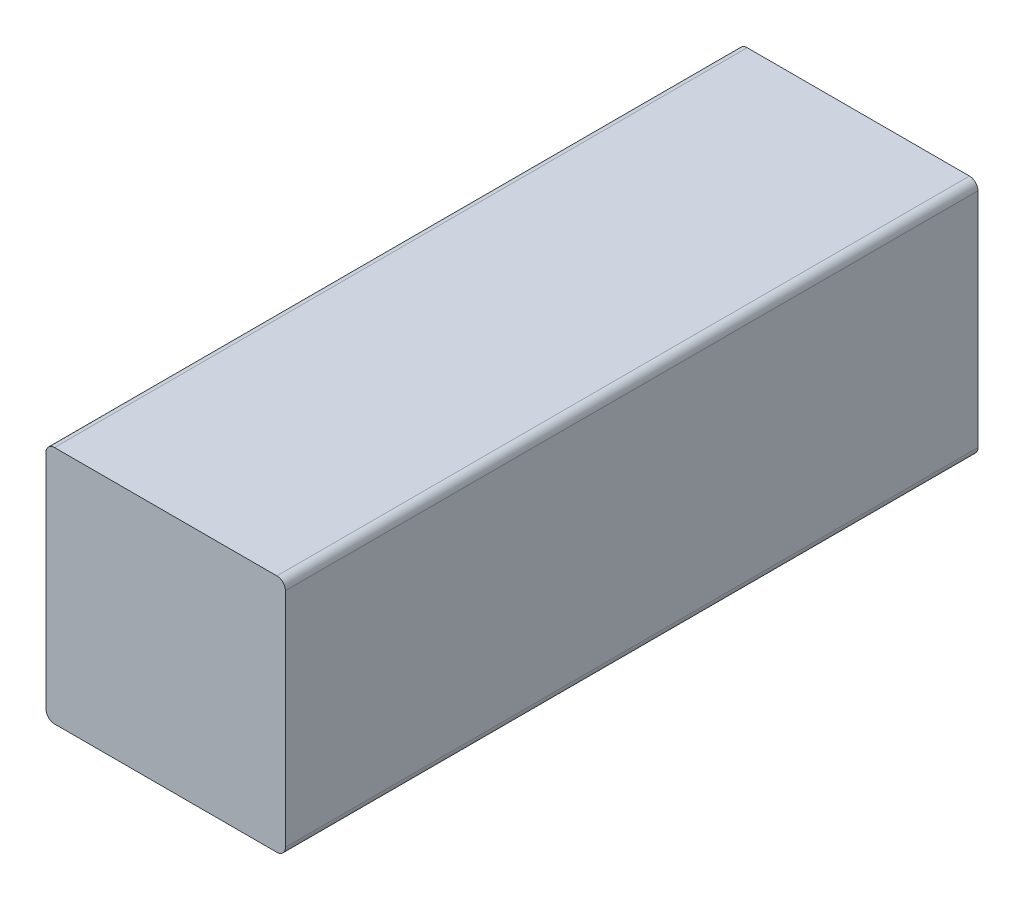
ISO-10303-21;
HEADER;
FILE_DESCRIPTION(('STEP AP214'),'2;1');
FILE_NAME('part.step','',(''),(''),'','','');
FILE_SCHEMA(('AUTOMOTIVE_DESIGN { 1 0 10303 214 1 1 1 1 }'));
ENDSEC;
DATA;
#1=APPLICATION_CONTEXT('core data for automotive mechanical design processes');
#2=APPLICATION_PROTOCOL_DEFINITION('international standard','automotive_design',2000,#1);
#3=PRODUCT_CONTEXT('',#1,'mechanical');
#4=PRODUCT('Part','Part','',(#3));
#5=PRODUCT_RELATED_PRODUCT_CATEGORY('part','',(#4));
#6=PRODUCT_DEFINITION_FORMATION('','',#4);
#7=PRODUCT_DEFINITION_CONTEXT('part definition',#1,'design');
#8=PRODUCT_DEFINITION('design','',#6,#7);
#9=PRODUCT_DEFINITION_SHAPE('','',#8);
#10=(LENGTH_UNIT() NAMED_UNIT(*) SI_UNIT(.MILLI.,.METRE.));
#11=(NAMED_UNIT(*) PLANE_ANGLE_UNIT() SI_UNIT($,.RADIAN.));
#12=(NAMED_UNIT(*) SI_UNIT($,.STERADIAN.) SOLID_ANGLE_UNIT());
#13=UNCERTAINTY_MEASURE_WITH_UNIT(LENGTH_MEASURE(1.E-05),#10,'distance_accuracy_value','');
#14=(GEOMETRIC_REPRESENTATION_CONTEXT(3) GLOBAL_UNCERTAINTY_ASSIGNED_CONTEXT((#13)) GLOBAL_UNIT_ASSIGNED_CONTEXT((#10,
#11,#12)) REPRESENTATION_CONTEXT('',''));
#15=CARTESIAN_POINT('',(0.,0.,0.));
#16=DIRECTION('',(0.,0.,1.));
#17=DIRECTION('',(1.,0.,0.));
#18=AXIS2_PLACEMENT_3D('',#15,#16,#17);
#19=CARTESIAN_POINT('',(44.45,88.9,-128.5875));
#20=DIRECTION('',(-1.,0.,0.));
#21=DIRECTION('',(0.,0.,1.));
#22=AXIS2_PLACEMENT_3D('',#19,#20,#21);
#23=PLANE('',#22);
#24=DIRECTION('',(0.,-1.,0.));
#25=VECTOR('',#24,1.);
#26=CARTESIAN_POINT('',(44.45,88.9,128.5875));
#27=LINE('',#26,#25);
#28=CARTESIAN_POINT('',(44.45,85.725,128.5875));
#29=VERTEX_POINT('',#28);
#30=CARTESIAN_POINT('',(44.45,3.175,128.5875));
#31=VERTEX_POINT('',#30);
#32=EDGE_CURVE('E121',#29,#31,#27,.T.);
#33=ORIENTED_EDGE('',*,*,#32,.T.);
#34=DIRECTION('',(0.,0.,-1.));
#35=VECTOR('',#34,1.);
#36=CARTESIAN_POINT('',(44.45,3.175,-128.5875));
#37=LINE('',#36,#35);
#38=CARTESIAN_POINT('',(44.45,3.175,-128.5875));
#39=VERTEX_POINT('',#38);
#40=EDGE_CURVE('E11',#31,#39,#37,.T.);
#41=ORIENTED_EDGE('',*,*,#40,.T.);
#42=DIRECTION('',(0.,-1.,0.));
#43=VECTOR('',#42,1.);
#44=CARTESIAN_POINT('',(44.45,88.9,-128.5875));
#45=LINE('',#44,#43);
#46=CARTESIAN_POINT('',(44.45,85.725,-128.5875));
#47=VERTEX_POINT('',#46);
#48=EDGE_CURVE('E126',#47,#39,#45,.T.);
#49=ORIENTED_EDGE('',*,*,#48,.F.);
#50=DIRECTION('',(0.,0.,-1.));
#51=VECTOR('',#50,1.);
#52=CARTESIAN_POINT('',(44.45,85.725,128.5875));
#53=LINE('',#52,#51);
#54=EDGE_CURVE('E41',#47,#29,#53,.F.);
#55=ORIENTED_EDGE('',*,*,#54,.T.);
#56=EDGE_LOOP('',(#33,#41,#49,#55));
#57=FACE_BOUND('',#56,.T.);
#58=ADVANCED_FACE('F33',(#57),#23,.F.);
#59=CARTESIAN_POINT('',(-44.45,88.9,-128.5875));
#60=DIRECTION('',(0.,0.,1.));
#61=DIRECTION('',(1.,0.,0.));
#62=AXIS2_PLACEMENT_3D('',#59,#60,#61);
#63=PLANE('',#62);
#64=DIRECTION('',(-1.,0.,0.));
#65=VECTOR('',#64,1.);
#66=CARTESIAN_POINT('',(-44.45,0.,-128.5875));
#67=LINE('',#66,#65);
#68=CARTESIAN_POINT('',(41.275,0.,-128.5875));
#69=VERTEX_POINT('',#68);
#70=CARTESIAN_POINT('',(-41.275,0.,-128.5875));
#71=VERTEX_POINT('',#70);
#72=EDGE_CURVE('E168',#69,#71,#67,.T.);
#73=ORIENTED_EDGE('',*,*,#72,.T.);
#74=CARTESIAN_POINT('',(-41.275,3.175,-128.5875));
#75=DIRECTION('',(0.,0.,1.));
#76=DIRECTION('',(1.,0.,0.));
#77=AXIS2_PLACEMENT_3D('',#74,#75,#76);
#78=CIRCLE('',#77,3.175);
#79=CARTESIAN_POINT('',(-44.45,3.175,-128.5875));
#80=VERTEX_POINT('',#79);
#81=EDGE_CURVE('E143',#71,#80,#78,.F.);
#82=ORIENTED_EDGE('',*,*,#81,.T.);
#83=DIRECTION('',(0.,-1.,0.));
#84=VECTOR('',#83,1.);
#85=CARTESIAN_POINT('',(-44.45,88.9,-128.5875));
#86=LINE('',#85,#84);
#87=CARTESIAN_POINT('',(-44.45,85.725,-128.5875));
#88=VERTEX_POINT('',#87);
#89=EDGE_CURVE('E120',#88,#80,#86,.T.);
#90=ORIENTED_EDGE('',*,*,#89,.F.);
#91=CARTESIAN_POINT('',(-41.275,85.725,-128.5875));
#92=DIRECTION('',(0.,0.,1.));
#93=DIRECTION('',(1.,0.,0.));
#94=AXIS2_PLACEMENT_3D('',#91,#92,#93);
#95=CIRCLE('',#94,3.175);
#96=CARTESIAN_POINT('',(-41.275,88.9,-128.5875));
#97=VERTEX_POINT('',#96);
#98=EDGE_CURVE('E125',#88,#97,#95,.F.);
#99=ORIENTED_EDGE('',*,*,#98,.T.);
#100=DIRECTION('',(-1.,0.,0.));
#101=VECTOR('',#100,1.);
#102=CARTESIAN_POINT('',(-44.45,88.9,-128.5875));
#103=LINE('',#102,#101);
#104=CARTESIAN_POINT('',(41.275,88.9,-128.5875));
#105=VERTEX_POINT('',#104);
#106=EDGE_CURVE('E162',#105,#97,#103,.T.);
#107=ORIENTED_EDGE('',*,*,#106,.F.);
#108=CARTESIAN_POINT('',(41.275,85.725,-128.5875));
#109=DIRECTION('',(0.,0.,1.));
#110=DIRECTION('',(1.,0.,0.));
#111=AXIS2_PLACEMENT_3D('',#108,#109,#110);
#112=CIRCLE('',#111,3.175);
#113=EDGE_CURVE('E55',#105,#47,#112,.F.);
#114=ORIENTED_EDGE('',*,*,#113,.T.);
#115=ORIENTED_EDGE('',*,*,#48,.T.);
#116=CARTESIAN_POINT('',(41.275,3.175,-128.5875));
#117=DIRECTION('',(0.,0.,1.));
#118=DIRECTION('',(1.,0.,0.));
#119=AXIS2_PLACEMENT_3D('',#116,#117,#118);
#120=CIRCLE('',#119,3.175);
#121=EDGE_CURVE('E48',#39,#69,#120,.F.);
#122=ORIENTED_EDGE('',*,*,#121,.T.);
#123=EDGE_LOOP('',(#73,#82,#90,#99,#107,#114,#115,#122));
#124=FACE_BOUND('',#123,.T.);
#125=ADVANCED_FACE('F164',(#124),#63,.F.);
#126=CARTESIAN_POINT('',(-44.45,88.9,-128.5875));
#127=DIRECTION('',(1.,0.,0.));
#128=DIRECTION('',(0.,0.,-1.));
#129=AXIS2_PLACEMENT_3D('',#126,#127,#128);
#130=PLANE('',#129);
#131=ORIENTED_EDGE('',*,*,#89,.T.);
#132=DIRECTION('',(0.,0.,1.));
#133=VECTOR('',#132,1.);
#134=CARTESIAN_POINT('',(-44.45,3.175,-128.5875));
#135=LINE('',#134,#133);
#136=CARTESIAN_POINT('',(-44.45,3.175,128.5875));
#137=VERTEX_POINT('',#136);
#138=EDGE_CURVE('E119',#80,#137,#135,.T.);
#139=ORIENTED_EDGE('',*,*,#138,.T.);
#140=DIRECTION('',(0.,-1.,0.));
#141=VECTOR('',#140,1.);
#142=CARTESIAN_POINT('',(-44.45,88.9,128.5875));
#143=LINE('',#142,#141);
#144=CARTESIAN_POINT('',(-44.45,85.725,128.5875));
#145=VERTEX_POINT('',#144);
#146=EDGE_CURVE('E102',#145,#137,#143,.T.);
#147=ORIENTED_EDGE('',*,*,#146,.F.);
#148=DIRECTION('',(0.,0.,1.));
#149=VECTOR('',#148,1.);
#150=CARTESIAN_POINT('',(-44.45,85.725,-128.5875));
#151=LINE('',#150,#149);
#152=EDGE_CURVE('E116',#145,#88,#151,.F.);
#153=ORIENTED_EDGE('',*,*,#152,.T.);
#154=EDGE_LOOP('',(#131,#139,#147,#153));
#155=FACE_BOUND('',#154,.T.);
#156=ADVANCED_FACE('F115',(#155),#130,.F.);
#157=CARTESIAN_POINT('',(-44.45,88.9,128.5875));
#158=DIRECTION('',(0.,0.,-1.));
#159=DIRECTION('',(-1.,0.,0.));
#160=AXIS2_PLACEMENT_3D('',#157,#158,#159);
#161=PLANE('',#160);
#162=ORIENTED_EDGE('',*,*,#146,.T.);
#163=CARTESIAN_POINT('',(-41.275,3.175,128.5875));
#164=DIRECTION('',(0.,0.,-1.));
#165=DIRECTION('',(-1.,0.,0.));
#166=AXIS2_PLACEMENT_3D('',#163,#164,#165);
#167=CIRCLE('',#166,3.175);
#168=CARTESIAN_POINT('',(-41.275,0.,128.5875));
#169=VERTEX_POINT('',#168);
#170=EDGE_CURVE('E109',#137,#169,#167,.F.);
#171=ORIENTED_EDGE('',*,*,#170,.T.);
#172=DIRECTION('',(1.,0.,0.));
#173=VECTOR('',#172,1.);
#174=CARTESIAN_POINT('',(-44.45,0.,128.5875));
#175=LINE('',#174,#173);
#176=CARTESIAN_POINT('',(41.275,0.,128.5875));
#177=VERTEX_POINT('',#176);
#178=EDGE_CURVE('E165',#169,#177,#175,.T.);
#179=ORIENTED_EDGE('',*,*,#178,.T.);
#180=CARTESIAN_POINT('',(41.275,3.175,128.5875));
#181=DIRECTION('',(0.,0.,-1.));
#182=DIRECTION('',(-1.,0.,0.));
#183=AXIS2_PLACEMENT_3D('',#180,#181,#182);
#184=CIRCLE('',#183,3.175);
#185=EDGE_CURVE('E110',#177,#31,#184,.F.);
#186=ORIENTED_EDGE('',*,*,#185,.T.);
#187=ORIENTED_EDGE('',*,*,#32,.F.);
#188=CARTESIAN_POINT('',(41.275,85.725,128.5875));
#189=DIRECTION('',(0.,0.,-1.));
#190=DIRECTION('',(-1.,0.,0.));
#191=AXIS2_PLACEMENT_3D('',#188,#189,#190);
#192=CIRCLE('',#191,3.175);
#193=CARTESIAN_POINT('',(41.275,88.9,128.5875));
#194=VERTEX_POINT('',#193);
#195=EDGE_CURVE('E128',#29,#194,#192,.F.);
#196=ORIENTED_EDGE('',*,*,#195,.T.);
#197=DIRECTION('',(1.,0.,0.));
#198=VECTOR('',#197,1.);
#199=CARTESIAN_POINT('',(-44.45,88.9,128.5875));
#200=LINE('',#199,#198);
#201=CARTESIAN_POINT('',(-41.275,88.9,128.5875));
#202=VERTEX_POINT('',#201);
#203=EDGE_CURVE('E104',#202,#194,#200,.T.);
#204=ORIENTED_EDGE('',*,*,#203,.F.);
#205=CARTESIAN_POINT('',(-41.275,85.725,128.5875));
#206=DIRECTION('',(0.,0.,-1.));
#207=DIRECTION('',(-1.,0.,0.));
#208=AXIS2_PLACEMENT_3D('',#205,#206,#207);
#209=CIRCLE('',#208,3.175);
#210=EDGE_CURVE('E99',#202,#145,#209,.F.);
#211=ORIENTED_EDGE('',*,*,#210,.T.);
#212=EDGE_LOOP('',(#162,#171,#179,#186,#187,#196,#204,#211));
#213=FACE_BOUND('',#212,.T.);
#214=ADVANCED_FACE('F101',(#213),#161,.F.);
#215=CARTESIAN_POINT('',(0.,88.9,0.));
#216=DIRECTION('',(0.,1.,0.));
#217=DIRECTION('',(0.,0.,1.));
#218=AXIS2_PLACEMENT_3D('',#215,#216,#217);
#219=PLANE('',#218);
#220=ORIENTED_EDGE('',*,*,#106,.T.);
#221=DIRECTION('',(0.,0.,1.));
#222=VECTOR('',#221,1.);
#223=CARTESIAN_POINT('',(-41.275,88.9,128.5875));
#224=LINE('',#223,#222);
#225=EDGE_CURVE('E148',#97,#202,#224,.T.);
#226=ORIENTED_EDGE('',*,*,#225,.T.);
#227=ORIENTED_EDGE('',*,*,#203,.T.);
#228=DIRECTION('',(0.,0.,-1.));
#229=VECTOR('',#228,1.);
#230=CARTESIAN_POINT('',(41.275,88.9,-128.5875));
#231=LINE('',#230,#229);
#232=EDGE_CURVE('E145',#194,#105,#231,.T.);
#233=ORIENTED_EDGE('',*,*,#232,.T.);
#234=EDGE_LOOP('',(#220,#226,#227,#233));
#235=FACE_BOUND('',#234,.T.);
#236=ADVANCED_FACE('F161',(#235),#219,.T.);
#237=CARTESIAN_POINT('',(0.,0.,0.));
#238=DIRECTION('',(0.,1.,0.));
#239=DIRECTION('',(0.,0.,1.));
#240=AXIS2_PLACEMENT_3D('',#237,#238,#239);
#241=PLANE('',#240);
#242=ORIENTED_EDGE('',*,*,#178,.F.);
#243=DIRECTION('',(0.,0.,1.));
#244=VECTOR('',#243,1.);
#245=CARTESIAN_POINT('',(-41.275,0.,0.));
#246=LINE('',#245,#244);
#247=EDGE_CURVE('E138',#169,#71,#246,.F.);
#248=ORIENTED_EDGE('',*,*,#247,.T.);
#249=ORIENTED_EDGE('',*,*,#72,.F.);
#250=DIRECTION('',(0.,0.,-1.));
#251=VECTOR('',#250,1.);
#252=CARTESIAN_POINT('',(41.275,0.,0.));
#253=LINE('',#252,#251);
#254=EDGE_CURVE('E136',#69,#177,#253,.F.);
#255=ORIENTED_EDGE('',*,*,#254,.T.);
#256=EDGE_LOOP('',(#242,#248,#249,#255));
#257=FACE_BOUND('',#256,.T.);
#258=ADVANCED_FACE('F177',(#257),#241,.F.);
#259=CARTESIAN_POINT('',(-41.275,3.175,-128.5875));
#260=DIRECTION('',(0.,0.,1.));
#261=DIRECTION('',(1.,0.,0.));
#262=AXIS2_PLACEMENT_3D('',#259,#260,#261);
#263=CYLINDRICAL_SURFACE('',#262,3.175);
#264=ORIENTED_EDGE('',*,*,#81,.F.);
#265=ORIENTED_EDGE('',*,*,#247,.F.);
#266=ORIENTED_EDGE('',*,*,#170,.F.);
#267=ORIENTED_EDGE('',*,*,#138,.F.);
#268=EDGE_LOOP('',(#264,#265,#266,#267));
#269=FACE_BOUND('',#268,.T.);
#270=ADVANCED_FACE('F173',(#269),#263,.T.);
#271=CARTESIAN_POINT('',(-41.275,85.725,0.));
#272=DIRECTION('',(0.,0.,-1.));
#273=DIRECTION('',(-1.,0.,0.));
#274=AXIS2_PLACEMENT_3D('',#271,#272,#273);
#275=CYLINDRICAL_SURFACE('',#274,3.175);
#276=ORIENTED_EDGE('',*,*,#98,.F.);
#277=ORIENTED_EDGE('',*,*,#152,.F.);
#278=ORIENTED_EDGE('',*,*,#210,.F.);
#279=ORIENTED_EDGE('',*,*,#225,.F.);
#280=EDGE_LOOP('',(#276,#277,#278,#279));
#281=FACE_BOUND('',#280,.T.);
#282=ADVANCED_FACE('F124',(#281),#275,.T.);
#283=CARTESIAN_POINT('',(41.275,3.175,-128.5875));
#284=DIRECTION('',(0.,0.,-1.));
#285=DIRECTION('',(-1.,0.,0.));
#286=AXIS2_PLACEMENT_3D('',#283,#284,#285);
#287=CYLINDRICAL_SURFACE('',#286,3.175);
#288=ORIENTED_EDGE('',*,*,#185,.F.);
#289=ORIENTED_EDGE('',*,*,#254,.F.);
#290=ORIENTED_EDGE('',*,*,#121,.F.);
#291=ORIENTED_EDGE('',*,*,#40,.F.);
#292=EDGE_LOOP('',(#288,#289,#290,#291));
#293=FACE_BOUND('',#292,.T.);
#294=ADVANCED_FACE('F179',(#293),#287,.T.);
#295=CARTESIAN_POINT('',(41.275,85.725,0.));
#296=DIRECTION('',(0.,0.,1.));
#297=DIRECTION('',(1.,0.,0.));
#298=AXIS2_PLACEMENT_3D('',#295,#296,#297);
#299=CYLINDRICAL_SURFACE('',#298,3.175);
#300=ORIENTED_EDGE('',*,*,#195,.F.);
#301=ORIENTED_EDGE('',*,*,#54,.F.);
#302=ORIENTED_EDGE('',*,*,#113,.F.);
#303=ORIENTED_EDGE('',*,*,#232,.F.);
#304=EDGE_LOOP('',(#300,#301,#302,#303));
#305=FACE_BOUND('',#304,.T.);
#306=ADVANCED_FACE('F35',(#305),#299,.T.);
#307=CLOSED_SHELL('',(#58,#125,#156,#214,#236,#258,#270,#282,#294,#306));
#308=MANIFOLD_SOLID_BREP('B2',#307);
#309=ADVANCED_BREP_SHAPE_REPRESENTATION('',(#18,#308),#14);
#310=SHAPE_DEFINITION_REPRESENTATION(#9,#309);
ENDSEC;
END-ISO-10303-21;
